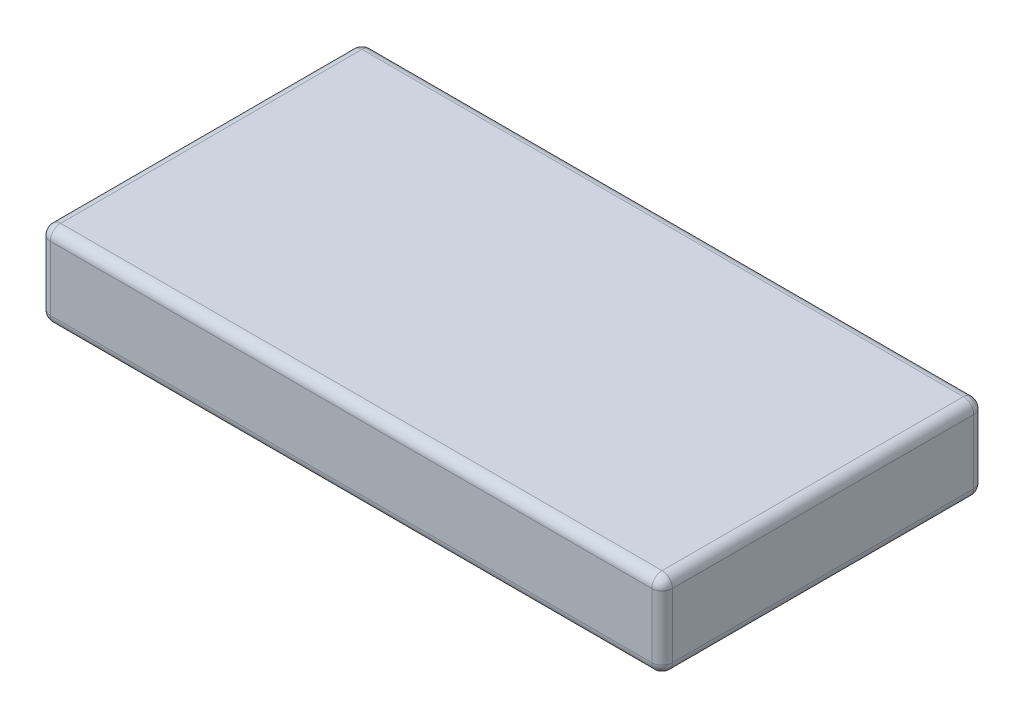
ISO-10303-21;
HEADER;
FILE_DESCRIPTION(('STEP AP214'),'2;1');
FILE_NAME('part.step','',(''),(''),'','','');
FILE_SCHEMA(('AUTOMOTIVE_DESIGN { 1 0 10303 214 1 1 1 1 }'));
ENDSEC;
DATA;
#1=APPLICATION_CONTEXT('core data for automotive mechanical design processes');
#2=APPLICATION_PROTOCOL_DEFINITION('international standard','automotive_design',2000,#1);
#3=PRODUCT_CONTEXT('',#1,'mechanical');
#4=PRODUCT('Part','Part','',(#3));
#5=PRODUCT_RELATED_PRODUCT_CATEGORY('part','',(#4));
#6=PRODUCT_DEFINITION_FORMATION('','',#4);
#7=PRODUCT_DEFINITION_CONTEXT('part definition',#1,'design');
#8=PRODUCT_DEFINITION('design','',#6,#7);
#9=PRODUCT_DEFINITION_SHAPE('','',#8);
#10=(LENGTH_UNIT() NAMED_UNIT(*) SI_UNIT(.MILLI.,.METRE.));
#11=(NAMED_UNIT(*) PLANE_ANGLE_UNIT() SI_UNIT($,.RADIAN.));
#12=(NAMED_UNIT(*) SI_UNIT($,.STERADIAN.) SOLID_ANGLE_UNIT());
#13=UNCERTAINTY_MEASURE_WITH_UNIT(LENGTH_MEASURE(1.E-05),#10,'distance_accuracy_value','');
#14=(GEOMETRIC_REPRESENTATION_CONTEXT(3) GLOBAL_UNCERTAINTY_ASSIGNED_CONTEXT((#13)) GLOBAL_UNIT_ASSIGNED_CONTEXT((#10,
#11,#12)) REPRESENTATION_CONTEXT('',''));
#15=CARTESIAN_POINT('',(0.,0.,0.));
#16=DIRECTION('',(0.,0.,1.));
#17=DIRECTION('',(1.,0.,0.));
#18=AXIS2_PLACEMENT_3D('',#15,#16,#17);
#19=CARTESIAN_POINT('',(30.0500000000001,-4.09999999999999,15.55));
#20=DIRECTION('',(-1.,0.,0.));
#21=DIRECTION('',(0.,0.,1.));
#22=AXIS2_PLACEMENT_3D('',#19,#20,#21);
#23=PLANE('',#22);
#24=DIRECTION('',(0.,0.,-1.));
#25=VECTOR('',#24,1.);
#26=CARTESIAN_POINT('',(30.0500000000001,3.10000000000001,15.55));
#27=LINE('',#26,#25);
#28=CARTESIAN_POINT('',(30.0500000000001,3.10000000000001,-14.55));
#29=VERTEX_POINT('',#28);
#30=CARTESIAN_POINT('',(30.0500000000001,3.10000000000001,14.55));
#31=VERTEX_POINT('',#30);
#32=EDGE_CURVE('E131',#29,#31,#27,.F.);
#33=ORIENTED_EDGE('',*,*,#32,.T.);
#34=DIRECTION('',(0.,1.,0.));
#35=VECTOR('',#34,1.);
#36=CARTESIAN_POINT('',(30.0500000000001,-4.09999999999999,14.55));
#37=LINE('',#36,#35);
#38=CARTESIAN_POINT('',(30.0500000000001,-3.09999999999999,14.55));
#39=VERTEX_POINT('',#38);
#40=EDGE_CURVE('E171',#31,#39,#37,.F.);
#41=ORIENTED_EDGE('',*,*,#40,.T.);
#42=DIRECTION('',(0.,0.,-1.));
#43=VECTOR('',#42,1.);
#44=CARTESIAN_POINT('',(30.0500000000001,-3.09999999999999,15.55));
#45=LINE('',#44,#43);
#46=CARTESIAN_POINT('',(30.0500000000001,-3.09999999999999,-14.55));
#47=VERTEX_POINT('',#46);
#48=EDGE_CURVE('E170',#39,#47,#45,.T.);
#49=ORIENTED_EDGE('',*,*,#48,.T.);
#50=DIRECTION('',(0.,1.,0.));
#51=VECTOR('',#50,1.);
#52=CARTESIAN_POINT('',(30.0500000000001,4.10000000000001,-14.55));
#53=LINE('',#52,#51);
#54=EDGE_CURVE('E164',#47,#29,#53,.T.);
#55=ORIENTED_EDGE('',*,*,#54,.T.);
#56=EDGE_LOOP('',(#33,#41,#49,#55));
#57=FACE_BOUND('',#56,.T.);
#58=ADVANCED_FACE('F39',(#57),#23,.F.);
#59=CARTESIAN_POINT('',(-30.0499999999999,4.10000000000001,15.55));
#60=DIRECTION('',(0.,-1.,0.));
#61=DIRECTION('',(0.,0.,-1.));
#62=AXIS2_PLACEMENT_3D('',#59,#60,#61);
#63=PLANE('',#62);
#64=DIRECTION('',(0.,0.,-1.));
#65=VECTOR('',#64,1.);
#66=CARTESIAN_POINT('',(-29.0499999999999,4.10000000000001,15.55));
#67=LINE('',#66,#65);
#68=CARTESIAN_POINT('',(-29.0499999999999,4.10000000000001,-14.55));
#69=VERTEX_POINT('',#68);
#70=CARTESIAN_POINT('',(-29.0499999999999,4.10000000000001,14.55));
#71=VERTEX_POINT('',#70);
#72=EDGE_CURVE('E157',#69,#71,#67,.F.);
#73=ORIENTED_EDGE('',*,*,#72,.T.);
#74=DIRECTION('',(-1.,0.,0.));
#75=VECTOR('',#74,1.);
#76=CARTESIAN_POINT('',(-30.0499999999999,4.10000000000001,14.55));
#77=LINE('',#76,#75);
#78=CARTESIAN_POINT('',(29.0500000000001,4.10000000000001,14.55));
#79=VERTEX_POINT('',#78);
#80=EDGE_CURVE('E158',#71,#79,#77,.F.);
#81=ORIENTED_EDGE('',*,*,#80,.T.);
#82=DIRECTION('',(0.,0.,-1.));
#83=VECTOR('',#82,1.);
#84=CARTESIAN_POINT('',(29.0500000000001,4.10000000000001,15.55));
#85=LINE('',#84,#83);
#86=CARTESIAN_POINT('',(29.0500000000001,4.10000000000001,-14.55));
#87=VERTEX_POINT('',#86);
#88=EDGE_CURVE('E135',#79,#87,#85,.T.);
#89=ORIENTED_EDGE('',*,*,#88,.T.);
#90=DIRECTION('',(-1.,0.,0.));
#91=VECTOR('',#90,1.);
#92=CARTESIAN_POINT('',(-30.0499999999999,4.10000000000001,-14.55));
#93=LINE('',#92,#91);
#94=EDGE_CURVE('E149',#87,#69,#93,.T.);
#95=ORIENTED_EDGE('',*,*,#94,.T.);
#96=EDGE_LOOP('',(#73,#81,#89,#95));
#97=FACE_BOUND('',#96,.T.);
#98=ADVANCED_FACE('F156',(#97),#63,.F.);
#99=CARTESIAN_POINT('',(-30.0499999999999,-4.09999999999999,15.55));
#100=DIRECTION('',(1.,0.,0.));
#101=DIRECTION('',(0.,0.,-1.));
#102=AXIS2_PLACEMENT_3D('',#99,#100,#101);
#103=PLANE('',#102);
#104=DIRECTION('',(0.,0.,-1.));
#105=VECTOR('',#104,1.);
#106=CARTESIAN_POINT('',(-30.0499999999999,-3.09999999999999,15.55));
#107=LINE('',#106,#105);
#108=CARTESIAN_POINT('',(-30.0499999999999,-3.09999999999999,-14.55));
#109=VERTEX_POINT('',#108);
#110=CARTESIAN_POINT('',(-30.0499999999999,-3.09999999999999,14.55));
#111=VERTEX_POINT('',#110);
#112=EDGE_CURVE('E174',#109,#111,#107,.F.);
#113=ORIENTED_EDGE('',*,*,#112,.T.);
#114=DIRECTION('',(0.,-1.,0.));
#115=VECTOR('',#114,1.);
#116=CARTESIAN_POINT('',(-30.0499999999999,-4.09999999999999,14.55));
#117=LINE('',#116,#115);
#118=CARTESIAN_POINT('',(-30.0499999999999,3.10000000000001,14.55));
#119=VERTEX_POINT('',#118);
#120=EDGE_CURVE('E179',#111,#119,#117,.F.);
#121=ORIENTED_EDGE('',*,*,#120,.T.);
#122=DIRECTION('',(0.,0.,-1.));
#123=VECTOR('',#122,1.);
#124=CARTESIAN_POINT('',(-30.0499999999999,3.10000000000001,15.55));
#125=LINE('',#124,#123);
#126=CARTESIAN_POINT('',(-30.0499999999999,3.10000000000001,-14.55));
#127=VERTEX_POINT('',#126);
#128=EDGE_CURVE('E180',#119,#127,#125,.T.);
#129=ORIENTED_EDGE('',*,*,#128,.T.);
#130=DIRECTION('',(0.,-1.,0.));
#131=VECTOR('',#130,1.);
#132=CARTESIAN_POINT('',(-30.0499999999999,-4.09999999999999,-14.55));
#133=LINE('',#132,#131);
#134=EDGE_CURVE('E172',#127,#109,#133,.T.);
#135=ORIENTED_EDGE('',*,*,#134,.T.);
#136=EDGE_LOOP('',(#113,#121,#129,#135));
#137=FACE_BOUND('',#136,.T.);
#138=ADVANCED_FACE('F283',(#137),#103,.F.);
#139=CARTESIAN_POINT('',(-30.0499999999999,-4.09999999999999,15.55));
#140=DIRECTION('',(0.,1.,0.));
#141=DIRECTION('',(0.,0.,1.));
#142=AXIS2_PLACEMENT_3D('',#139,#140,#141);
#143=PLANE('',#142);
#144=DIRECTION('',(0.,0.,-1.));
#145=VECTOR('',#144,1.);
#146=CARTESIAN_POINT('',(29.0500000000001,-4.09999999999999,15.55));
#147=LINE('',#146,#145);
#148=CARTESIAN_POINT('',(29.0500000000001,-4.09999999999999,-14.55));
#149=VERTEX_POINT('',#148);
#150=CARTESIAN_POINT('',(29.0500000000001,-4.09999999999999,14.55));
#151=VERTEX_POINT('',#150);
#152=EDGE_CURVE('E185',#149,#151,#147,.F.);
#153=ORIENTED_EDGE('',*,*,#152,.T.);
#154=DIRECTION('',(1.,0.,0.));
#155=VECTOR('',#154,1.);
#156=CARTESIAN_POINT('',(-30.0499999999999,-4.09999999999999,14.55));
#157=LINE('',#156,#155);
#158=CARTESIAN_POINT('',(-29.0499999999999,-4.09999999999999,14.55));
#159=VERTEX_POINT('',#158);
#160=EDGE_CURVE('E189',#151,#159,#157,.F.);
#161=ORIENTED_EDGE('',*,*,#160,.T.);
#162=DIRECTION('',(0.,0.,-1.));
#163=VECTOR('',#162,1.);
#164=CARTESIAN_POINT('',(-29.0499999999999,-4.09999999999999,15.55));
#165=LINE('',#164,#163);
#166=CARTESIAN_POINT('',(-29.0499999999999,-4.09999999999999,-14.55));
#167=VERTEX_POINT('',#166);
#168=EDGE_CURVE('E188',#159,#167,#165,.T.);
#169=ORIENTED_EDGE('',*,*,#168,.T.);
#170=DIRECTION('',(1.,0.,0.));
#171=VECTOR('',#170,1.);
#172=CARTESIAN_POINT('',(30.0500000000001,-4.09999999999999,-14.55));
#173=LINE('',#172,#171);
#174=EDGE_CURVE('E182',#167,#149,#173,.T.);
#175=ORIENTED_EDGE('',*,*,#174,.T.);
#176=EDGE_LOOP('',(#153,#161,#169,#175));
#177=FACE_BOUND('',#176,.T.);
#178=ADVANCED_FACE('F292',(#177),#143,.F.);
#179=CARTESIAN_POINT('',(0.,0.,15.55));
#180=DIRECTION('',(0.,0.,-1.));
#181=DIRECTION('',(-1.,0.,0.));
#182=AXIS2_PLACEMENT_3D('',#179,#180,#181);
#183=PLANE('',#182);
#184=DIRECTION('',(0.,-1.,0.));
#185=VECTOR('',#184,1.);
#186=CARTESIAN_POINT('',(-29.0499999999999,0.,15.55));
#187=LINE('',#186,#185);
#188=CARTESIAN_POINT('',(-29.0499999999999,3.10000000000001,15.55));
#189=VERTEX_POINT('',#188);
#190=CARTESIAN_POINT('',(-29.0499999999999,-3.09999999999999,15.55));
#191=VERTEX_POINT('',#190);
#192=EDGE_CURVE('E194',#189,#191,#187,.T.);
#193=ORIENTED_EDGE('',*,*,#192,.T.);
#194=DIRECTION('',(1.,0.,0.));
#195=VECTOR('',#194,1.);
#196=CARTESIAN_POINT('',(0.,-3.09999999999999,15.55));
#197=LINE('',#196,#195);
#198=CARTESIAN_POINT('',(29.0500000000001,-3.09999999999999,15.55));
#199=VERTEX_POINT('',#198);
#200=EDGE_CURVE('E200',#191,#199,#197,.T.);
#201=ORIENTED_EDGE('',*,*,#200,.T.);
#202=DIRECTION('',(0.,1.,0.));
#203=VECTOR('',#202,1.);
#204=CARTESIAN_POINT('',(29.0500000000001,0.,15.55));
#205=LINE('',#204,#203);
#206=CARTESIAN_POINT('',(29.0500000000001,3.10000000000001,15.55));
#207=VERTEX_POINT('',#206);
#208=EDGE_CURVE('E191',#199,#207,#205,.T.);
#209=ORIENTED_EDGE('',*,*,#208,.T.);
#210=DIRECTION('',(-1.,0.,0.));
#211=VECTOR('',#210,1.);
#212=CARTESIAN_POINT('',(0.,3.10000000000001,15.55));
#213=LINE('',#212,#211);
#214=EDGE_CURVE('E193',#207,#189,#213,.T.);
#215=ORIENTED_EDGE('',*,*,#214,.T.);
#216=EDGE_LOOP('',(#193,#201,#209,#215));
#217=FACE_BOUND('',#216,.T.);
#218=ADVANCED_FACE('F280',(#217),#183,.F.);
#219=CARTESIAN_POINT('',(0.,0.,-15.55));
#220=DIRECTION('',(0.,0.,-1.));
#221=DIRECTION('',(-1.,0.,0.));
#222=AXIS2_PLACEMENT_3D('',#219,#220,#221);
#223=PLANE('',#222);
#224=DIRECTION('',(0.,1.,0.));
#225=VECTOR('',#224,1.);
#226=CARTESIAN_POINT('',(29.0500000000001,-4.09999999999999,-15.55));
#227=LINE('',#226,#225);
#228=CARTESIAN_POINT('',(29.0500000000001,3.10000000000001,-15.55));
#229=VERTEX_POINT('',#228);
#230=CARTESIAN_POINT('',(29.0500000000001,-3.09999999999999,-15.55));
#231=VERTEX_POINT('',#230);
#232=EDGE_CURVE('E199',#229,#231,#227,.F.);
#233=ORIENTED_EDGE('',*,*,#232,.T.);
#234=DIRECTION('',(1.,0.,0.));
#235=VECTOR('',#234,1.);
#236=CARTESIAN_POINT('',(-30.0499999999999,-3.09999999999999,-15.55));
#237=LINE('',#236,#235);
#238=CARTESIAN_POINT('',(-29.0499999999999,-3.09999999999999,-15.55));
#239=VERTEX_POINT('',#238);
#240=EDGE_CURVE('E11',#231,#239,#237,.F.);
#241=ORIENTED_EDGE('',*,*,#240,.T.);
#242=DIRECTION('',(0.,-1.,0.));
#243=VECTOR('',#242,1.);
#244=CARTESIAN_POINT('',(-29.0499999999999,4.10000000000001,-15.55));
#245=LINE('',#244,#243);
#246=CARTESIAN_POINT('',(-29.0499999999999,3.10000000000001,-15.55));
#247=VERTEX_POINT('',#246);
#248=EDGE_CURVE('E48',#239,#247,#245,.F.);
#249=ORIENTED_EDGE('',*,*,#248,.T.);
#250=DIRECTION('',(-1.,0.,0.));
#251=VECTOR('',#250,1.);
#252=CARTESIAN_POINT('',(30.0500000000001,3.10000000000001,-15.55));
#253=LINE('',#252,#251);
#254=EDGE_CURVE('E205',#247,#229,#253,.F.);
#255=ORIENTED_EDGE('',*,*,#254,.T.);
#256=EDGE_LOOP('',(#233,#241,#249,#255));
#257=FACE_BOUND('',#256,.T.);
#258=ADVANCED_FACE('F481',(#257),#223,.T.);
#259=CARTESIAN_POINT('',(-29.0499999999999,-3.09999999999999,15.55));
#260=DIRECTION('',(0.,0.,-1.));
#261=DIRECTION('',(-1.,0.,0.));
#262=AXIS2_PLACEMENT_3D('',#259,#260,#261);
#263=CYLINDRICAL_SURFACE('',#262,1.);
#264=CARTESIAN_POINT('',(-29.0499999999999,-3.09999999999999,14.55));
#265=DIRECTION('',(0.,0.,1.));
#266=DIRECTION('',(1.,0.,0.));
#267=AXIS2_PLACEMENT_3D('',#264,#265,#266);
#268=CIRCLE('',#267,1.);
#269=EDGE_CURVE('E43',#111,#159,#268,.T.);
#270=ORIENTED_EDGE('',*,*,#269,.F.);
#271=ORIENTED_EDGE('',*,*,#112,.F.);
#272=CARTESIAN_POINT('',(-29.0499999999999,-3.09999999999999,-14.55));
#273=DIRECTION('',(0.,0.,-1.));
#274=DIRECTION('',(-1.,0.,0.));
#275=AXIS2_PLACEMENT_3D('',#272,#273,#274);
#276=CIRCLE('',#275,1.);
#277=EDGE_CURVE('E254',#167,#109,#276,.T.);
#278=ORIENTED_EDGE('',*,*,#277,.F.);
#279=ORIENTED_EDGE('',*,*,#168,.F.);
#280=EDGE_LOOP('',(#270,#271,#278,#279));
#281=FACE_BOUND('',#280,.T.);
#282=ADVANCED_FACE('F41',(#281),#263,.T.);
#283=CARTESIAN_POINT('',(-29.0499999999999,-3.09999999999999,14.55));
#284=DIRECTION('',(0.,-1.,0.));
#285=DIRECTION('',(0.,0.,-1.));
#286=AXIS2_PLACEMENT_3D('',#283,#284,#285);
#287=SPHERICAL_SURFACE('',#286,1.);
#288=CARTESIAN_POINT('',(-29.0499999999999,-3.09999999999999,14.55));
#289=DIRECTION('',(0.,-1.,0.));
#290=DIRECTION('',(0.,0.,-1.));
#291=AXIS2_PLACEMENT_3D('',#288,#289,#290);
#292=CIRCLE('',#291,1.);
#293=EDGE_CURVE('E249',#111,#191,#292,.F.);
#294=ORIENTED_EDGE('',*,*,#293,.F.);
#295=ORIENTED_EDGE('',*,*,#269,.T.);
#296=CARTESIAN_POINT('',(-29.0499999999999,-3.09999999999999,14.55));
#297=DIRECTION('',(-1.,0.,0.));
#298=DIRECTION('',(0.,0.,1.));
#299=AXIS2_PLACEMENT_3D('',#296,#297,#298);
#300=CIRCLE('',#299,1.);
#301=EDGE_CURVE('E251',#191,#159,#300,.F.);
#302=ORIENTED_EDGE('',*,*,#301,.F.);
#303=EDGE_LOOP('',(#294,#295,#302));
#304=FACE_BOUND('',#303,.T.);
#305=ADVANCED_FACE('F262',(#304),#287,.T.);
#306=CARTESIAN_POINT('',(-29.0499999999999,-3.09999999999999,-14.55));
#307=DIRECTION('',(-1.,0.,0.));
#308=DIRECTION('',(0.,0.,1.));
#309=AXIS2_PLACEMENT_3D('',#306,#307,#308);
#310=SPHERICAL_SURFACE('',#309,1.);
#311=CARTESIAN_POINT('',(-29.0499999999999,-3.09999999999999,-14.55));
#312=DIRECTION('',(-1.,0.,0.));
#313=DIRECTION('',(0.,0.,1.));
#314=AXIS2_PLACEMENT_3D('',#311,#312,#313);
#315=CIRCLE('',#314,1.);
#316=EDGE_CURVE('E242',#167,#239,#315,.F.);
#317=ORIENTED_EDGE('',*,*,#316,.F.);
#318=ORIENTED_EDGE('',*,*,#277,.T.);
#319=CARTESIAN_POINT('',(-29.0499999999999,-3.09999999999999,-14.55));
#320=DIRECTION('',(0.,-1.,0.));
#321=DIRECTION('',(0.,0.,-1.));
#322=AXIS2_PLACEMENT_3D('',#319,#320,#321);
#323=CIRCLE('',#322,1.);
#324=EDGE_CURVE('E247',#239,#109,#323,.F.);
#325=ORIENTED_EDGE('',*,*,#324,.F.);
#326=EDGE_LOOP('',(#317,#318,#325));
#327=FACE_BOUND('',#326,.T.);
#328=ADVANCED_FACE('F465',(#327),#310,.T.);
#329=CARTESIAN_POINT('',(0.,-3.09999999999999,14.55));
#330=DIRECTION('',(1.,0.,0.));
#331=DIRECTION('',(0.,0.,-1.));
#332=AXIS2_PLACEMENT_3D('',#329,#330,#331);
#333=CYLINDRICAL_SURFACE('',#332,1.);
#334=ORIENTED_EDGE('',*,*,#301,.T.);
#335=ORIENTED_EDGE('',*,*,#160,.F.);
#336=CARTESIAN_POINT('',(29.0500000000001,-3.09999999999999,14.55));
#337=DIRECTION('',(1.,0.,0.));
#338=DIRECTION('',(0.,0.,-1.));
#339=AXIS2_PLACEMENT_3D('',#336,#337,#338);
#340=CIRCLE('',#339,1.);
#341=EDGE_CURVE('E236',#199,#151,#340,.T.);
#342=ORIENTED_EDGE('',*,*,#341,.F.);
#343=ORIENTED_EDGE('',*,*,#200,.F.);
#344=EDGE_LOOP('',(#334,#335,#342,#343));
#345=FACE_BOUND('',#344,.T.);
#346=ADVANCED_FACE('F273',(#345),#333,.T.);
#347=CARTESIAN_POINT('',(-29.0499999999999,0.,14.55));
#348=DIRECTION('',(0.,-1.,0.));
#349=DIRECTION('',(0.,0.,-1.));
#350=AXIS2_PLACEMENT_3D('',#347,#348,#349);
#351=CYLINDRICAL_SURFACE('',#350,1.);
#352=ORIENTED_EDGE('',*,*,#293,.T.);
#353=ORIENTED_EDGE('',*,*,#192,.F.);
#354=CARTESIAN_POINT('',(-29.0499999999999,3.10000000000001,14.55));
#355=DIRECTION('',(0.,1.,0.));
#356=DIRECTION('',(0.,0.,1.));
#357=AXIS2_PLACEMENT_3D('',#354,#355,#356);
#358=CIRCLE('',#357,1.);
#359=EDGE_CURVE('E237',#119,#189,#358,.T.);
#360=ORIENTED_EDGE('',*,*,#359,.F.);
#361=ORIENTED_EDGE('',*,*,#120,.F.);
#362=EDGE_LOOP('',(#352,#353,#360,#361));
#363=FACE_BOUND('',#362,.T.);
#364=ADVANCED_FACE('F285',(#363),#351,.T.);
#365=CARTESIAN_POINT('',(-29.0499999999999,3.10000000000001,15.55));
#366=DIRECTION('',(0.,0.,-1.));
#367=DIRECTION('',(-1.,0.,0.));
#368=AXIS2_PLACEMENT_3D('',#365,#366,#367);
#369=CYLINDRICAL_SURFACE('',#368,1.);
#370=CARTESIAN_POINT('',(-29.0499999999999,3.10000000000001,-14.55));
#371=DIRECTION('',(0.,0.,-1.));
#372=DIRECTION('',(-1.,0.,0.));
#373=AXIS2_PLACEMENT_3D('',#370,#371,#372);
#374=CIRCLE('',#373,1.);
#375=EDGE_CURVE('E229',#127,#69,#374,.T.);
#376=ORIENTED_EDGE('',*,*,#375,.F.);
#377=ORIENTED_EDGE('',*,*,#128,.F.);
#378=CARTESIAN_POINT('',(-29.0499999999999,3.10000000000001,14.55));
#379=DIRECTION('',(0.,0.,1.));
#380=DIRECTION('',(1.,0.,0.));
#381=AXIS2_PLACEMENT_3D('',#378,#379,#380);
#382=CIRCLE('',#381,1.);
#383=EDGE_CURVE('E231',#71,#119,#382,.T.);
#384=ORIENTED_EDGE('',*,*,#383,.F.);
#385=ORIENTED_EDGE('',*,*,#72,.F.);
#386=EDGE_LOOP('',(#376,#377,#384,#385));
#387=FACE_BOUND('',#386,.T.);
#388=ADVANCED_FACE('F286',(#387),#369,.T.);
#389=CARTESIAN_POINT('',(-29.0499999999999,-4.09999999999999,-14.55));
#390=DIRECTION('',(0.,1.,0.));
#391=DIRECTION('',(0.,0.,1.));
#392=AXIS2_PLACEMENT_3D('',#389,#390,#391);
#393=CYLINDRICAL_SURFACE('',#392,1.);
#394=ORIENTED_EDGE('',*,*,#324,.T.);
#395=ORIENTED_EDGE('',*,*,#134,.F.);
#396=CARTESIAN_POINT('',(-29.0499999999999,3.10000000000001,-14.55));
#397=DIRECTION('',(0.,1.,0.));
#398=DIRECTION('',(0.,0.,1.));
#399=AXIS2_PLACEMENT_3D('',#396,#397,#398);
#400=CIRCLE('',#399,1.);
#401=EDGE_CURVE('E226',#247,#127,#400,.T.);
#402=ORIENTED_EDGE('',*,*,#401,.F.);
#403=ORIENTED_EDGE('',*,*,#248,.F.);
#404=EDGE_LOOP('',(#394,#395,#402,#403));
#405=FACE_BOUND('',#404,.T.);
#406=ADVANCED_FACE('F295',(#405),#393,.T.);
#407=CARTESIAN_POINT('',(-30.0499999999999,-3.09999999999999,-14.55));
#408=DIRECTION('',(-1.,0.,0.));
#409=DIRECTION('',(0.,0.,1.));
#410=AXIS2_PLACEMENT_3D('',#407,#408,#409);
#411=CYLINDRICAL_SURFACE('',#410,1.);
#412=ORIENTED_EDGE('',*,*,#316,.T.);
#413=ORIENTED_EDGE('',*,*,#240,.F.);
#414=CARTESIAN_POINT('',(29.0500000000001,-3.09999999999999,-14.55));
#415=DIRECTION('',(1.,0.,0.));
#416=DIRECTION('',(0.,0.,-1.));
#417=AXIS2_PLACEMENT_3D('',#414,#415,#416);
#418=CIRCLE('',#417,1.);
#419=EDGE_CURVE('E224',#149,#231,#418,.T.);
#420=ORIENTED_EDGE('',*,*,#419,.F.);
#421=ORIENTED_EDGE('',*,*,#174,.F.);
#422=EDGE_LOOP('',(#412,#413,#420,#421));
#423=FACE_BOUND('',#422,.T.);
#424=ADVANCED_FACE('F304',(#423),#411,.T.);
#425=CARTESIAN_POINT('',(29.0500000000001,-3.09999999999999,15.55));
#426=DIRECTION('',(0.,0.,-1.));
#427=DIRECTION('',(-1.,0.,0.));
#428=AXIS2_PLACEMENT_3D('',#425,#426,#427);
#429=CYLINDRICAL_SURFACE('',#428,1.);
#430=CARTESIAN_POINT('',(29.0500000000001,-3.09999999999999,14.55));
#431=DIRECTION('',(0.,0.,1.));
#432=DIRECTION('',(1.,0.,0.));
#433=AXIS2_PLACEMENT_3D('',#430,#431,#432);
#434=CIRCLE('',#433,1.);
#435=EDGE_CURVE('E241',#151,#39,#434,.T.);
#436=ORIENTED_EDGE('',*,*,#435,.F.);
#437=ORIENTED_EDGE('',*,*,#152,.F.);
#438=CARTESIAN_POINT('',(29.0500000000001,-3.09999999999999,-14.55));
#439=DIRECTION('',(0.,0.,-1.));
#440=DIRECTION('',(-1.,0.,0.));
#441=AXIS2_PLACEMENT_3D('',#438,#439,#440);
#442=CIRCLE('',#441,1.);
#443=EDGE_CURVE('E225',#47,#149,#442,.T.);
#444=ORIENTED_EDGE('',*,*,#443,.F.);
#445=ORIENTED_EDGE('',*,*,#48,.F.);
#446=EDGE_LOOP('',(#436,#437,#444,#445));
#447=FACE_BOUND('',#446,.T.);
#448=ADVANCED_FACE('F299',(#447),#429,.T.);
#449=CARTESIAN_POINT('',(29.0500000000001,-3.09999999999999,14.55));
#450=DIRECTION('',(0.,-1.,0.));
#451=DIRECTION('',(0.,0.,-1.));
#452=AXIS2_PLACEMENT_3D('',#449,#450,#451);
#453=SPHERICAL_SURFACE('',#452,1.);
#454=ORIENTED_EDGE('',*,*,#341,.T.);
#455=ORIENTED_EDGE('',*,*,#435,.T.);
#456=CARTESIAN_POINT('',(29.0500000000001,-3.09999999999999,14.55));
#457=DIRECTION('',(0.,-1.,0.));
#458=DIRECTION('',(0.,0.,-1.));
#459=AXIS2_PLACEMENT_3D('',#456,#457,#458);
#460=CIRCLE('',#459,1.);
#461=EDGE_CURVE('E218',#199,#39,#460,.F.);
#462=ORIENTED_EDGE('',*,*,#461,.F.);
#463=EDGE_LOOP('',(#454,#455,#462));
#464=FACE_BOUND('',#463,.T.);
#465=ADVANCED_FACE('F319',(#464),#453,.T.);
#466=CARTESIAN_POINT('',(-29.0499999999999,3.10000000000001,14.55));
#467=DIRECTION('',(-1.,0.,0.));
#468=DIRECTION('',(0.,0.,1.));
#469=AXIS2_PLACEMENT_3D('',#466,#467,#468);
#470=SPHERICAL_SURFACE('',#469,1.);
#471=ORIENTED_EDGE('',*,*,#383,.T.);
#472=ORIENTED_EDGE('',*,*,#359,.T.);
#473=CARTESIAN_POINT('',(-29.0499999999999,3.10000000000001,14.55));
#474=DIRECTION('',(-1.,0.,0.));
#475=DIRECTION('',(0.,0.,1.));
#476=AXIS2_PLACEMENT_3D('',#473,#474,#475);
#477=CIRCLE('',#476,1.);
#478=EDGE_CURVE('E219',#71,#189,#477,.F.);
#479=ORIENTED_EDGE('',*,*,#478,.F.);
#480=EDGE_LOOP('',(#471,#472,#479));
#481=FACE_BOUND('',#480,.T.);
#482=ADVANCED_FACE('F328',(#481),#470,.T.);
#483=CARTESIAN_POINT('',(-29.0499999999999,3.10000000000001,-14.55));
#484=DIRECTION('',(-1.,0.,0.));
#485=DIRECTION('',(0.,0.,1.));
#486=AXIS2_PLACEMENT_3D('',#483,#484,#485);
#487=SPHERICAL_SURFACE('',#486,1.);
#488=ORIENTED_EDGE('',*,*,#401,.T.);
#489=ORIENTED_EDGE('',*,*,#375,.T.);
#490=CARTESIAN_POINT('',(-29.0499999999999,3.10000000000001,-14.55));
#491=DIRECTION('',(-1.,0.,0.));
#492=DIRECTION('',(0.,0.,1.));
#493=AXIS2_PLACEMENT_3D('',#490,#491,#492);
#494=CIRCLE('',#493,1.);
#495=EDGE_CURVE('E151',#247,#69,#494,.F.);
#496=ORIENTED_EDGE('',*,*,#495,.F.);
#497=EDGE_LOOP('',(#488,#489,#496));
#498=FACE_BOUND('',#497,.T.);
#499=ADVANCED_FACE('F326',(#498),#487,.T.);
#500=CARTESIAN_POINT('',(29.0500000000001,-3.09999999999999,-14.55));
#501=DIRECTION('',(0.,-1.,0.));
#502=DIRECTION('',(0.,0.,-1.));
#503=AXIS2_PLACEMENT_3D('',#500,#501,#502);
#504=SPHERICAL_SURFACE('',#503,1.);
#505=ORIENTED_EDGE('',*,*,#443,.T.);
#506=ORIENTED_EDGE('',*,*,#419,.T.);
#507=CARTESIAN_POINT('',(29.0500000000001,-3.09999999999999,-14.55));
#508=DIRECTION('',(0.,-1.,0.));
#509=DIRECTION('',(0.,0.,-1.));
#510=AXIS2_PLACEMENT_3D('',#507,#508,#509);
#511=CIRCLE('',#510,1.);
#512=EDGE_CURVE('E215',#47,#231,#511,.F.);
#513=ORIENTED_EDGE('',*,*,#512,.F.);
#514=EDGE_LOOP('',(#505,#506,#513));
#515=FACE_BOUND('',#514,.T.);
#516=ADVANCED_FACE('F310',(#515),#504,.T.);
#517=CARTESIAN_POINT('',(29.0500000000001,0.,14.55));
#518=DIRECTION('',(0.,1.,0.));
#519=DIRECTION('',(0.,0.,1.));
#520=AXIS2_PLACEMENT_3D('',#517,#518,#519);
#521=CYLINDRICAL_SURFACE('',#520,1.);
#522=ORIENTED_EDGE('',*,*,#461,.T.);
#523=ORIENTED_EDGE('',*,*,#40,.F.);
#524=CARTESIAN_POINT('',(29.0500000000001,3.10000000000001,14.55));
#525=DIRECTION('',(0.,1.,0.));
#526=DIRECTION('',(0.,0.,1.));
#527=AXIS2_PLACEMENT_3D('',#524,#525,#526);
#528=CIRCLE('',#527,1.);
#529=EDGE_CURVE('E206',#207,#31,#528,.T.);
#530=ORIENTED_EDGE('',*,*,#529,.F.);
#531=ORIENTED_EDGE('',*,*,#208,.F.);
#532=EDGE_LOOP('',(#522,#523,#530,#531));
#533=FACE_BOUND('',#532,.T.);
#534=ADVANCED_FACE('F320',(#533),#521,.T.);
#535=CARTESIAN_POINT('',(0.,3.10000000000001,14.55));
#536=DIRECTION('',(-1.,0.,0.));
#537=DIRECTION('',(0.,0.,1.));
#538=AXIS2_PLACEMENT_3D('',#535,#536,#537);
#539=CYLINDRICAL_SURFACE('',#538,1.);
#540=ORIENTED_EDGE('',*,*,#478,.T.);
#541=ORIENTED_EDGE('',*,*,#214,.F.);
#542=CARTESIAN_POINT('',(29.0500000000001,3.10000000000001,14.55));
#543=DIRECTION('',(1.,0.,0.));
#544=DIRECTION('',(0.,0.,-1.));
#545=AXIS2_PLACEMENT_3D('',#542,#543,#544);
#546=CIRCLE('',#545,1.);
#547=EDGE_CURVE('E150',#79,#207,#546,.T.);
#548=ORIENTED_EDGE('',*,*,#547,.F.);
#549=ORIENTED_EDGE('',*,*,#80,.F.);
#550=EDGE_LOOP('',(#540,#541,#548,#549));
#551=FACE_BOUND('',#550,.T.);
#552=ADVANCED_FACE('F323',(#551),#539,.T.);
#553=CARTESIAN_POINT('',(-30.0499999999999,3.10000000000001,-14.55));
#554=DIRECTION('',(1.,0.,0.));
#555=DIRECTION('',(0.,0.,-1.));
#556=AXIS2_PLACEMENT_3D('',#553,#554,#555);
#557=CYLINDRICAL_SURFACE('',#556,1.);
#558=ORIENTED_EDGE('',*,*,#495,.T.);
#559=ORIENTED_EDGE('',*,*,#94,.F.);
#560=CARTESIAN_POINT('',(29.0500000000001,3.10000000000001,-14.55));
#561=DIRECTION('',(1.,0.,0.));
#562=DIRECTION('',(0.,0.,-1.));
#563=AXIS2_PLACEMENT_3D('',#560,#561,#562);
#564=CIRCLE('',#563,1.);
#565=EDGE_CURVE('E138',#229,#87,#564,.T.);
#566=ORIENTED_EDGE('',*,*,#565,.F.);
#567=ORIENTED_EDGE('',*,*,#254,.F.);
#568=EDGE_LOOP('',(#558,#559,#566,#567));
#569=FACE_BOUND('',#568,.T.);
#570=ADVANCED_FACE('F153',(#569),#557,.T.);
#571=CARTESIAN_POINT('',(29.0500000000001,-4.09999999999999,-14.55));
#572=DIRECTION('',(0.,-1.,0.));
#573=DIRECTION('',(0.,0.,-1.));
#574=AXIS2_PLACEMENT_3D('',#571,#572,#573);
#575=CYLINDRICAL_SURFACE('',#574,1.);
#576=ORIENTED_EDGE('',*,*,#512,.T.);
#577=ORIENTED_EDGE('',*,*,#232,.F.);
#578=CARTESIAN_POINT('',(29.0500000000001,3.10000000000001,-14.55));
#579=DIRECTION('',(0.,1.,0.));
#580=DIRECTION('',(0.,0.,1.));
#581=AXIS2_PLACEMENT_3D('',#578,#579,#580);
#582=CIRCLE('',#581,1.);
#583=EDGE_CURVE('E143',#29,#229,#582,.T.);
#584=ORIENTED_EDGE('',*,*,#583,.F.);
#585=ORIENTED_EDGE('',*,*,#54,.F.);
#586=EDGE_LOOP('',(#576,#577,#584,#585));
#587=FACE_BOUND('',#586,.T.);
#588=ADVANCED_FACE('F312',(#587),#575,.T.);
#589=CARTESIAN_POINT('',(29.0500000000001,3.10000000000001,14.55));
#590=DIRECTION('',(0.,0.,1.));
#591=DIRECTION('',(1.,0.,0.));
#592=AXIS2_PLACEMENT_3D('',#589,#590,#591);
#593=SPHERICAL_SURFACE('',#592,1.);
#594=ORIENTED_EDGE('',*,*,#547,.T.);
#595=ORIENTED_EDGE('',*,*,#529,.T.);
#596=CARTESIAN_POINT('',(29.0500000000001,3.10000000000001,14.55));
#597=DIRECTION('',(0.,0.,1.));
#598=DIRECTION('',(1.,0.,0.));
#599=AXIS2_PLACEMENT_3D('',#596,#597,#598);
#600=CIRCLE('',#599,1.);
#601=EDGE_CURVE('E140',#79,#31,#600,.F.);
#602=ORIENTED_EDGE('',*,*,#601,.F.);
#603=EDGE_LOOP('',(#594,#595,#602));
#604=FACE_BOUND('',#603,.T.);
#605=ADVANCED_FACE('F325',(#604),#593,.T.);
#606=CARTESIAN_POINT('',(29.0500000000001,3.10000000000001,-14.55));
#607=DIRECTION('',(0.,0.,-1.));
#608=DIRECTION('',(-1.,0.,0.));
#609=AXIS2_PLACEMENT_3D('',#606,#607,#608);
#610=SPHERICAL_SURFACE('',#609,1.);
#611=ORIENTED_EDGE('',*,*,#583,.T.);
#612=ORIENTED_EDGE('',*,*,#565,.T.);
#613=CARTESIAN_POINT('',(29.0500000000001,3.10000000000001,-14.55));
#614=DIRECTION('',(0.,0.,-1.));
#615=DIRECTION('',(-1.,0.,0.));
#616=AXIS2_PLACEMENT_3D('',#613,#614,#615);
#617=CIRCLE('',#616,1.);
#618=EDGE_CURVE('E127',#29,#87,#617,.F.);
#619=ORIENTED_EDGE('',*,*,#618,.F.);
#620=EDGE_LOOP('',(#611,#612,#619));
#621=FACE_BOUND('',#620,.T.);
#622=ADVANCED_FACE('F141',(#621),#610,.T.);
#623=CARTESIAN_POINT('',(29.0500000000001,3.10000000000001,15.55));
#624=DIRECTION('',(0.,0.,-1.));
#625=DIRECTION('',(-1.,0.,0.));
#626=AXIS2_PLACEMENT_3D('',#623,#624,#625);
#627=CYLINDRICAL_SURFACE('',#626,1.);
#628=ORIENTED_EDGE('',*,*,#601,.T.);
#629=ORIENTED_EDGE('',*,*,#32,.F.);
#630=ORIENTED_EDGE('',*,*,#618,.T.);
#631=ORIENTED_EDGE('',*,*,#88,.F.);
#632=EDGE_LOOP('',(#628,#629,#630,#631));
#633=FACE_BOUND('',#632,.T.);
#634=ADVANCED_FACE('F129',(#633),#627,.T.);
#635=CLOSED_SHELL('',(#58,#98,#138,#178,#218,#258,#282,#305,#328,#346,#364,#388,#406,#424,#448,
#465,#482,#499,#516,#534,#552,#570,#588,#605,#622,#634));
#636=MANIFOLD_SOLID_BREP('B2',#635);
#637=ADVANCED_BREP_SHAPE_REPRESENTATION('',(#18,#636),#14);
#638=SHAPE_DEFINITION_REPRESENTATION(#9,#637);
ENDSEC;
END-ISO-10303-21;
